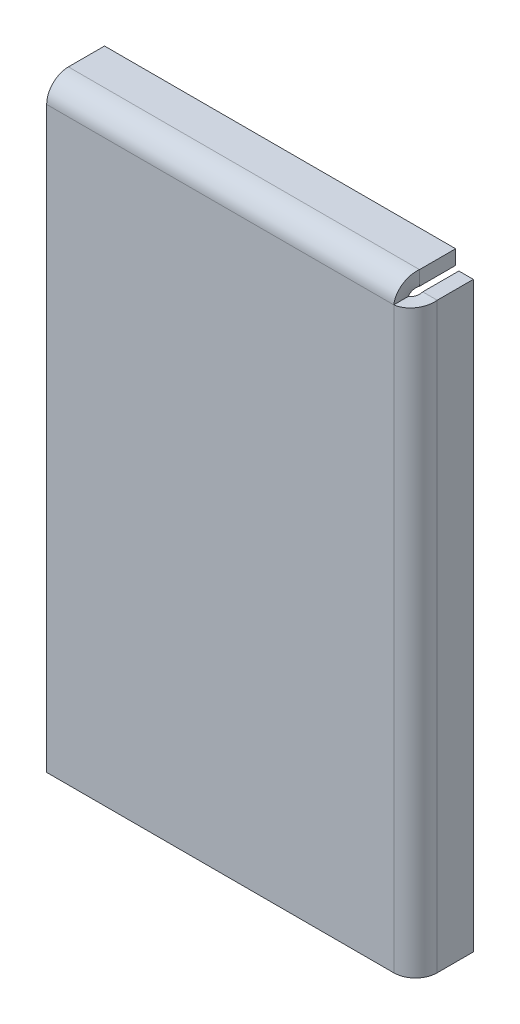
ISO-10303-21;
HEADER;
FILE_DESCRIPTION(('STEP AP214'),'2;1');
FILE_NAME('part.step','',(''),(''),'','','');
FILE_SCHEMA(('AUTOMOTIVE_DESIGN { 1 0 10303 214 1 1 1 1 }'));
ENDSEC;
DATA;
#1=APPLICATION_CONTEXT('core data for automotive mechanical design processes');
#2=APPLICATION_PROTOCOL_DEFINITION('international standard','automotive_design',2000,#1);
#3=PRODUCT_CONTEXT('',#1,'mechanical');
#4=PRODUCT('Part','Part','',(#3));
#5=PRODUCT_RELATED_PRODUCT_CATEGORY('part','',(#4));
#6=PRODUCT_DEFINITION_FORMATION('','',#4);
#7=PRODUCT_DEFINITION_CONTEXT('part definition',#1,'design');
#8=PRODUCT_DEFINITION('design','',#6,#7);
#9=PRODUCT_DEFINITION_SHAPE('','',#8);
#10=(LENGTH_UNIT() NAMED_UNIT(*) SI_UNIT(.MILLI.,.METRE.));
#11=(NAMED_UNIT(*) PLANE_ANGLE_UNIT() SI_UNIT($,.RADIAN.));
#12=(NAMED_UNIT(*) SI_UNIT($,.STERADIAN.) SOLID_ANGLE_UNIT());
#13=UNCERTAINTY_MEASURE_WITH_UNIT(LENGTH_MEASURE(1.E-05),#10,'distance_accuracy_value','');
#14=(GEOMETRIC_REPRESENTATION_CONTEXT(3) GLOBAL_UNCERTAINTY_ASSIGNED_CONTEXT((#13)) GLOBAL_UNIT_ASSIGNED_CONTEXT((#10,
#11,#12)) REPRESENTATION_CONTEXT('',''));
#15=CARTESIAN_POINT('',(0.,0.,0.));
#16=DIRECTION('',(0.,0.,1.));
#17=DIRECTION('',(1.,0.,0.));
#18=AXIS2_PLACEMENT_3D('',#15,#16,#17);
#19=CARTESIAN_POINT('',(0.,0.,-3.175));
#20=DIRECTION('',(-1.,0.,0.));
#21=DIRECTION('',(0.,-1.,0.));
#22=AXIS2_PLACEMENT_3D('',#19,#20,#21);
#23=PLANE('',#22);
#24=DIRECTION('',(0.,-1.,0.));
#25=VECTOR('',#24,1.);
#26=CARTESIAN_POINT('',(0.,0.,0.));
#27=LINE('',#26,#25);
#28=CARTESIAN_POINT('',(0.,127.,0.));
#29=VERTEX_POINT('',#28);
#30=CARTESIAN_POINT('',(0.,0.,0.));
#31=VERTEX_POINT('',#30);
#32=EDGE_CURVE('E230',#29,#31,#27,.T.);
#33=ORIENTED_EDGE('',*,*,#32,.F.);
#34=DIRECTION('',(0.,0.,1.));
#35=VECTOR('',#34,1.);
#36=CARTESIAN_POINT('',(0.,127.,-3.175));
#37=LINE('',#36,#35);
#38=CARTESIAN_POINT('',(0.,127.,-3.17499999999999));
#39=VERTEX_POINT('',#38);
#40=EDGE_CURVE('E13',#39,#29,#37,.T.);
#41=ORIENTED_EDGE('',*,*,#40,.F.);
#42=DIRECTION('',(0.,-1.,0.));
#43=VECTOR('',#42,1.);
#44=CARTESIAN_POINT('',(0.,0.,-3.175));
#45=LINE('',#44,#43);
#46=CARTESIAN_POINT('',(0.,0.,-3.175));
#47=VERTEX_POINT('',#46);
#48=EDGE_CURVE('E228',#39,#47,#45,.T.);
#49=ORIENTED_EDGE('',*,*,#48,.T.);
#50=DIRECTION('',(0.,0.,1.));
#51=VECTOR('',#50,1.);
#52=CARTESIAN_POINT('',(0.,0.,-3.175));
#53=LINE('',#52,#51);
#54=EDGE_CURVE('E81',#47,#31,#53,.T.);
#55=ORIENTED_EDGE('',*,*,#54,.T.);
#56=EDGE_LOOP('',(#33,#41,#49,#55));
#57=FACE_BOUND('',#56,.T.);
#58=ADVANCED_FACE('F78',(#57),#23,.T.);
#59=CARTESIAN_POINT('',(0.,0.,-3.175));
#60=DIRECTION('',(0.,-1.,0.));
#61=DIRECTION('',(0.,0.,-1.));
#62=AXIS2_PLACEMENT_3D('',#59,#60,#61);
#63=PLANE('',#62);
#64=DIRECTION('',(1.,0.,0.));
#65=VECTOR('',#64,1.);
#66=CARTESIAN_POINT('',(0.,0.,0.));
#67=LINE('',#66,#65);
#68=CARTESIAN_POINT('',(76.2000000000001,0.,0.));
#69=VERTEX_POINT('',#68);
#70=EDGE_CURVE('E248',#31,#69,#67,.T.);
#71=ORIENTED_EDGE('',*,*,#70,.F.);
#72=ORIENTED_EDGE('',*,*,#54,.F.);
#73=DIRECTION('',(1.,0.,0.));
#74=VECTOR('',#73,1.);
#75=CARTESIAN_POINT('',(0.,0.,-3.175));
#76=LINE('',#75,#74);
#77=CARTESIAN_POINT('',(76.2,0.,-3.17500000000002));
#78=VERTEX_POINT('',#77);
#79=EDGE_CURVE('E232',#47,#78,#76,.T.);
#80=ORIENTED_EDGE('',*,*,#79,.T.);
#81=DIRECTION('',(0.,0.,1.));
#82=VECTOR('',#81,1.);
#83=CARTESIAN_POINT('',(76.2,0.,-3.175));
#84=LINE('',#83,#82);
#85=EDGE_CURVE('E254',#78,#69,#84,.T.);
#86=ORIENTED_EDGE('',*,*,#85,.T.);
#87=EDGE_LOOP('',(#71,#72,#80,#86));
#88=FACE_BOUND('',#87,.T.);
#89=ADVANCED_FACE('F256',(#88),#63,.T.);
#90=CARTESIAN_POINT('',(0.,0.,-3.175));
#91=DIRECTION('',(0.,0.,-1.));
#92=DIRECTION('',(-1.,0.,0.));
#93=AXIS2_PLACEMENT_3D('',#90,#91,#92);
#94=PLANE('',#93);
#95=ORIENTED_EDGE('',*,*,#48,.F.);
#96=DIRECTION('',(-1.,0.,0.));
#97=VECTOR('',#96,1.);
#98=CARTESIAN_POINT('',(0.,127.,-3.175));
#99=LINE('',#98,#97);
#100=CARTESIAN_POINT('',(76.2,127.,-3.17499999999999));
#101=VERTEX_POINT('',#100);
#102=EDGE_CURVE('E214',#101,#39,#99,.T.);
#103=ORIENTED_EDGE('',*,*,#102,.F.);
#104=DIRECTION('',(0.,1.,0.));
#105=VECTOR('',#104,1.);
#106=CARTESIAN_POINT('',(76.2,0.,-3.175));
#107=LINE('',#106,#105);
#108=EDGE_CURVE('E222',#78,#101,#107,.T.);
#109=ORIENTED_EDGE('',*,*,#108,.F.);
#110=ORIENTED_EDGE('',*,*,#79,.F.);
#111=EDGE_LOOP('',(#95,#103,#109,#110));
#112=FACE_BOUND('',#111,.T.);
#113=ADVANCED_FACE('F231',(#112),#94,.T.);
#114=CARTESIAN_POINT('',(0.,0.,0.));
#115=DIRECTION('',(0.,0.,-1.));
#116=DIRECTION('',(-1.,0.,0.));
#117=AXIS2_PLACEMENT_3D('',#114,#115,#116);
#118=PLANE('',#117);
#119=ORIENTED_EDGE('',*,*,#32,.T.);
#120=ORIENTED_EDGE('',*,*,#70,.T.);
#121=DIRECTION('',(0.,1.,0.));
#122=VECTOR('',#121,1.);
#123=CARTESIAN_POINT('',(76.2,0.,0.));
#124=LINE('',#123,#122);
#125=CARTESIAN_POINT('',(76.2,127.,0.));
#126=VERTEX_POINT('',#125);
#127=EDGE_CURVE('E112',#69,#126,#124,.T.);
#128=ORIENTED_EDGE('',*,*,#127,.T.);
#129=DIRECTION('',(-1.,0.,0.));
#130=VECTOR('',#129,1.);
#131=CARTESIAN_POINT('',(0.,127.,0.));
#132=LINE('',#131,#130);
#133=EDGE_CURVE('E170',#126,#29,#132,.T.);
#134=ORIENTED_EDGE('',*,*,#133,.T.);
#135=EDGE_LOOP('',(#119,#120,#128,#134));
#136=FACE_BOUND('',#135,.T.);
#137=ADVANCED_FACE('F259',(#136),#118,.F.);
#138=CARTESIAN_POINT('',(76.1999999999999,127.,0.0317499999999844));
#139=CARTESIAN_POINT('',(76.8276774966241,127.073379161431,0.0317499999999954));
#140=CARTESIAN_POINT('',(77.4548847945894,127.146732203136,-0.0930314948829234));
#141=CARTESIAN_POINT('',(78.6144752966431,127.293464406271,-0.573349607632581));
#142=CARTESIAN_POINT('',(79.1462906122397,127.366830507839,-0.928697240832497));
#143=CARTESIAN_POINT('',(80.0338027591674,127.513562710975,-1.81620938776023));
#144=CARTESIAN_POINT('',(80.3891503923674,127.586928812542,-2.34802470335679));
#145=CARTESIAN_POINT('',(80.869468505117,127.733661015678,-3.5076152054105));
#146=CARTESIAN_POINT('',(80.99425,127.807014057382,-4.13482250337581));
#147=CARTESIAN_POINT('',(80.99425,127.880393218813,-4.76249999999998));
#148=CARTESIAN_POINT('',(76.1999999999999,127.,0.));
#149=CARTESIAN_POINT('',(76.8235206558448,127.073379148578,0.));
#150=CARTESIAN_POINT('',(77.446574299261,127.146732203136,-0.123955127367142));
#151=CARTESIAN_POINT('',(78.5984853940163,127.293464406271,-0.601092325462828));
#152=CARTESIAN_POINT('',(79.1267787538805,127.366830507839,-0.954086663078639));
#153=CARTESIAN_POINT('',(80.0084133369213,127.513562710975,-1.83572124611944));
#154=CARTESIAN_POINT('',(80.3614076745371,127.586928812542,-2.36401460598357));
#155=CARTESIAN_POINT('',(80.8385448726328,127.733661015678,-3.5159257007389));
#156=CARTESIAN_POINT('',(80.9625,127.807014070236,-4.13897934415511));
#157=CARTESIAN_POINT('',(80.9625,127.880393218813,-4.76249999999998));
#158=CARTESIAN_POINT('',(76.2,127.,-3.17500000000002));
#159=CARTESIAN_POINT('',(76.4078365779154,127.073377863208,-3.17500000000001));
#160=CARTESIAN_POINT('',(76.6155247664203,127.146732203136,-3.21631837578906));
#161=CARTESIAN_POINT('',(76.9994951313388,127.293464406271,-3.37536410848762));
#162=CARTESIAN_POINT('',(77.1755929179601,127.366830507839,-3.49302888769289));
#163=CARTESIAN_POINT('',(77.4694711123071,127.513562710975,-3.78690708203982));
#164=CARTESIAN_POINT('',(77.5871358915123,127.586928812542,-3.96300486866119));
#165=CARTESIAN_POINT('',(77.7461816242109,127.733661015678,-4.34697523357963));
#166=CARTESIAN_POINT('',(77.7875,127.807015355605,-4.55466342208453));
#167=CARTESIAN_POINT('',(77.7875,127.880393218813,-4.76249999999999));
#168=CARTESIAN_POINT('',(76.2,127.,-3.20706750000002));
#169=CARTESIAN_POINT('',(76.4036381687283,127.073377850226,-3.20706750000001));
#170=CARTESIAN_POINT('',(76.6071311661386,127.146732203136,-3.24755124459812));
#171=CARTESIAN_POINT('',(76.9833453296857,127.293464406271,-3.40338425349617));
#172=CARTESIAN_POINT('',(77.1558859410173,127.366830507839,-3.51867220416149));
#173=CARTESIAN_POINT('',(77.4438277958385,127.513562710975,-3.80661405898261));
#174=CARTESIAN_POINT('',(77.5591157465038,127.586928812542,-3.97915467031424));
#175=CARTESIAN_POINT('',(77.7149487554019,127.733661015678,-4.35536883386133));
#176=CARTESIAN_POINT('',(77.7554325,127.807015368587,-4.55886183127162));
#177=CARTESIAN_POINT('',(77.7554325,127.880393218813,-4.76249999999999));
#178=B_SPLINE_SURFACE_WITH_KNOTS('',1,3,((#138,#139,#140,#141,#142,#143,#144,#145,#146,#147),
(#148,#149,#150,#151,#152,#153,#154,#155,#156,#157),(#158,#159,#160,#161,#162,#163,#164,#165,
#166,#167),(#168,#169,#170,#171,#172,#173,#174,#175,#176,#177)),.UNSPECIFIED.,.F.,.F.,.F.,(2,1,
1,2),(4,2,2,2,4),(-0.01,0.,1.,1.0101),(0.,0.25,0.5,0.75,1.),.UNSPECIFIED.);
#179=DIRECTION('',(1.,0.,0.));
#180=VECTOR('',#179,1.);
#181=CARTESIAN_POINT('',(80.9625,127.880393218813,-4.76249999999998));
#182=LINE('',#181,#180);
#183=CARTESIAN_POINT('',(77.7875,127.880393218813,-4.76249999999999));
#184=VERTEX_POINT('',#183);
#185=CARTESIAN_POINT('',(80.9625,127.880393218813,-4.76249999999998));
#186=VERTEX_POINT('',#185);
#187=EDGE_CURVE('E136',#184,#186,#182,.T.);
#188=CARTESIAN_POINT('',(76.2,127.,-3.17500000000002));
#189=CARTESIAN_POINT('',(76.247402363432,127.016737010737,-3.17499981475755));
#190=CARTESIAN_POINT('',(76.2947822769868,127.033465079396,-3.17712453359083));
#191=CARTESIAN_POINT('',(76.3891605386355,127.066919593609,-3.18559757266885));
#192=CARTESIAN_POINT('',(76.4361589072465,127.083646039202,-3.19194566426525));
#193=CARTESIAN_POINT('',(76.575926664022,127.133793425001,-3.21725746041942));
#194=CARTESIAN_POINT('',(76.6676313331067,127.167238923494,-3.24248888627525));
#195=CARTESIAN_POINT('',(76.8450849089598,127.234132703975,-3.30887906161228));
#196=CARTESIAN_POINT('',(76.9308305381412,127.267580977521,-3.35004649569549));
#197=CARTESIAN_POINT('',(77.0936118667121,127.334470091219,-3.44698505194963));
#198=CARTESIAN_POINT('',(77.1706498450795,127.367910931019,-3.5027523402974));
#199=CARTESIAN_POINT('',(77.3135304452291,127.434780889932,-3.62708221310954));
#200=CARTESIAN_POINT('',(77.3793778688464,127.4682100079,-3.69563928288917));
#201=CARTESIAN_POINT('',(77.4978469905643,127.53507910458,-3.8434145963099));
#202=CARTESIAN_POINT('',(77.5504631890003,127.568519082042,-3.92263725224968));
#203=CARTESIAN_POINT('',(77.640769428935,127.635413567451,-4.08920529368376));
#204=CARTESIAN_POINT('',(77.678452613197,127.668868075028,-4.17655438815678));
#205=CARTESIAN_POINT('',(77.7376190345457,127.735749379145,-4.35650969066247));
#206=CARTESIAN_POINT('',(77.7591238131584,127.769176153126,-4.44910873099431));
#207=CARTESIAN_POINT('',(77.7773130996071,127.815550849876,-4.57919718644025));
#208=CARTESIAN_POINT('',(77.7811345356246,127.828531431925,-4.61578656039871));
#209=CARTESIAN_POINT('',(77.7862248825719,127.854470385735,-4.68907863702643));
#210=CARTESIAN_POINT('',(77.787498208551,127.867428756976,-4.72578103312478));
#211=CARTESIAN_POINT('',(77.7875,127.880393218813,-4.76249999999999));
#212=B_SPLINE_CURVE_WITH_KNOTS('',3,(#188,#189,#190,#191,#192,#193,#194,#195,#196,#197,#198,
#199,#200,#201,#202,#203,#204,#205,#206,#207,#208,#209,#210,#211),.UNSPECIFIED.,.F.,.F.,(4,2,2,
2,2,2,2,2,2,2,2,4),(0.,0.1507183594396,0.301428559831404,0.602339044283586,0.903413746471715,
1.2044094676375,1.50527570448953,1.80626679285071,2.10739593653535,2.4081234140516,
2.52509160845968,2.64185695878851),.UNSPECIFIED.);
#213=EDGE_CURVE('E237',#101,#184,#212,.T.);
#214=DIRECTION('',(0.,0.,1.));
#215=VECTOR('',#214,1.);
#216=CARTESIAN_POINT('',(76.2,127.,-3.175));
#217=LINE('',#216,#215);
#218=EDGE_CURVE('E87',#101,#126,#217,.T.);
#219=CARTESIAN_POINT('',(76.1999999999999,127.,0.));
#220=CARTESIAN_POINT('',(76.3351217373917,127.015902452668,1.49130135511463E-05));
#221=CARTESIAN_POINT('',(76.4702413553164,127.031804653429,-0.00574988729570535));
#222=CARTESIAN_POINT('',(76.7394971488482,127.063607609756,-0.0287312355015262));
#223=CARTESIAN_POINT('',(76.8736333708521,127.079508365356,-0.0459472395661578));
#224=CARTESIAN_POINT('',(77.1398527086578,127.111296644366,-0.0917055490820597));
#225=CARTESIAN_POINT('',(77.2719373389093,127.127184168457,-0.120239042567627));
#226=CARTESIAN_POINT('',(77.53320373712,127.158960443307,-0.188421043753178));
#227=CARTESIAN_POINT('',(77.6623855459769,127.174849194044,-0.228069394750131));
#228=CARTESIAN_POINT('',(77.916729620662,127.206603567169,-0.318130474196733));
#229=CARTESIAN_POINT('',(78.0418974464399,127.222469189667,-0.368527501335669));
#230=CARTESIAN_POINT('',(78.2875526929391,127.254206617939,-0.47977689466703));
#231=CARTESIAN_POINT('',(78.4080383760234,127.270078423842,-0.540633097882401));
#232=CARTESIAN_POINT('',(78.6433474070995,127.301811832784,-0.67231328692068));
#233=CARTESIAN_POINT('',(78.7581738111848,127.317673436661,-0.743131811507612));
#234=CARTESIAN_POINT('',(78.9814461663099,127.349402355197,-0.8942777136956));
#235=CARTESIAN_POINT('',(79.0898898860102,127.365269669925,-0.974608387460757));
#236=CARTESIAN_POINT('',(79.2995516663174,127.397002672854,-1.14416349750693));
#237=CARTESIAN_POINT('',(79.4007710956283,127.41286836079,-1.23338624139178));
#238=CARTESIAN_POINT('',(79.5952776857689,127.444599400131,-1.4200953330034));
#239=CARTESIAN_POINT('',(79.6885648458592,127.460464751535,-1.51758168150049));
#240=CARTESIAN_POINT('',(79.8665697071934,127.492201528687,-1.72015543784046));
#241=CARTESIAN_POINT('',(79.9512840131085,127.508072954362,-1.8252458292679));
#242=CARTESIAN_POINT('',(80.1114624248026,127.539808967282,-2.04219798184568));
#243=CARTESIAN_POINT('',(80.1869297323854,127.555673554988,-2.15405737904998));
#244=CARTESIAN_POINT('',(80.3281453507705,127.587413105389,-2.38384111802048));
#245=CARTESIAN_POINT('',(80.393887990194,127.603288068758,-2.50176894525578));
#246=CARTESIAN_POINT('',(80.5151055010885,127.635032578791,-2.74273403138111));
#247=CARTESIAN_POINT('',(80.5705841068999,127.65090212532,-2.8657694119746));
#248=CARTESIAN_POINT('',(80.6708848992769,127.682636059502,-3.11606098760628));
#249=CARTESIAN_POINT('',(80.7157108764114,127.698500446979,-3.24331566285286));
#250=CARTESIAN_POINT('',(80.7943998898735,127.730222763945,-3.50112561233577));
#251=CARTESIAN_POINT('',(80.8282658217052,127.746080694031,-3.63168000498657));
#252=CARTESIAN_POINT('',(80.8917440289277,127.781695032184,-3.92758289656774));
#253=CARTESIAN_POINT('',(80.9182691884881,127.801452432098,-4.09360236702804));
#254=CARTESIAN_POINT('',(80.9536537049578,127.840938184339,-4.42725548909671));
#255=CARTESIAN_POINT('',(80.9625399688205,127.860666534965,-4.59488628956768));
#256=CARTESIAN_POINT('',(80.9625,127.880393218813,-4.76249999999998));
#257=B_SPLINE_CURVE_WITH_KNOTS('',3,(#219,#220,#221,#222,#223,#224,#225,#226,#227,#228,#229,
#230,#231,#232,#233,#234,#235,#236,#237,#238,#239,#240,#241,#242,#243,#244,#245,#246,#247,#248,
#249,#250,#251,#252,#253,#254,#255,#256),.UNSPECIFIED.,.F.,.F.,(4,2,2,2,2,2,2,2,2,2,2,2,2,2,2,2,
2,2,4),(0.,0.408037813372089,0.816056249903534,1.22375761888679,1.63145324017354,
2.03855734295494,2.44581111480624,2.85284249831813,3.26001534199348,3.66711083736656,
4.07420637068784,4.4814625106892,4.8885772360041,5.29592846037993,5.70313118635492,
6.1101887980107,6.51713878228911,7.02402879516921,7.53014498525619),.UNSPECIFIED.);
#258=EDGE_CURVE('E249',#126,#186,#257,.T.);
#259=ORIENTED_EDGE('',*,*,#187,.F.);
#260=ORIENTED_EDGE('',*,*,#213,.F.);
#261=ORIENTED_EDGE('',*,*,#218,.T.);
#262=ORIENTED_EDGE('',*,*,#258,.T.);
#263=EDGE_LOOP('',(#259,#260,#261,#262));
#264=FACE_BOUND('',#263,.T.);
#265=ADVANCED_FACE('F261',(#264),#178,.F.);
#266=CARTESIAN_POINT('',(76.2,0.,-4.76249999999999));
#267=DIRECTION('',(0.,1.,0.));
#268=DIRECTION('',(0.,0.,1.));
#269=AXIS2_PLACEMENT_3D('',#266,#267,#268);
#270=PLANE('',#269);
#271=CARTESIAN_POINT('',(76.2,0.,-4.76249999999999));
#272=DIRECTION('',(0.,-1.,0.));
#273=DIRECTION('',(0.,0.,-1.));
#274=AXIS2_PLACEMENT_3D('',#271,#272,#273);
#275=CIRCLE('',#274,1.58749999999998);
#276=CARTESIAN_POINT('',(77.7875,0.,-4.76249999999999));
#277=VERTEX_POINT('',#276);
#278=EDGE_CURVE('E532',#277,#78,#275,.T.);
#279=ORIENTED_EDGE('',*,*,#278,.F.);
#280=DIRECTION('',(1.,0.,0.));
#281=VECTOR('',#280,1.);
#282=CARTESIAN_POINT('',(77.7875,0.,-4.76249999999999));
#283=LINE('',#282,#281);
#284=CARTESIAN_POINT('',(80.9625,0.,-4.76249999999998));
#285=VERTEX_POINT('',#284);
#286=EDGE_CURVE('E554',#277,#285,#283,.T.);
#287=ORIENTED_EDGE('',*,*,#286,.T.);
#288=CARTESIAN_POINT('',(76.2,0.,-4.76249999999999));
#289=DIRECTION('',(0.,-1.,0.));
#290=DIRECTION('',(0.,0.,-1.));
#291=AXIS2_PLACEMENT_3D('',#288,#289,#290);
#292=CIRCLE('',#291,4.76249999999998);
#293=EDGE_CURVE('E139',#285,#69,#292,.T.);
#294=ORIENTED_EDGE('',*,*,#293,.T.);
#295=ORIENTED_EDGE('',*,*,#85,.F.);
#296=EDGE_LOOP('',(#279,#287,#294,#295));
#297=FACE_BOUND('',#296,.T.);
#298=ADVANCED_FACE('F267',(#297),#270,.F.);
#299=CARTESIAN_POINT('',(76.2,0.,-4.76249999999999));
#300=DIRECTION('',(0.,-1.,0.));
#301=DIRECTION('',(1.,0.,0.));
#302=AXIS2_PLACEMENT_3D('',#299,#300,#301);
#303=CYLINDRICAL_SURFACE('',#302,4.76249999999998);
#304=ORIENTED_EDGE('',*,*,#127,.F.);
#305=ORIENTED_EDGE('',*,*,#293,.F.);
#306=DIRECTION('',(0.,-1.,0.));
#307=VECTOR('',#306,1.);
#308=CARTESIAN_POINT('',(80.9625,0.,-4.76249999999998));
#309=LINE('',#308,#307);
#310=EDGE_CURVE('E556',#186,#285,#309,.T.);
#311=ORIENTED_EDGE('',*,*,#310,.F.);
#312=ORIENTED_EDGE('',*,*,#258,.F.);
#313=EDGE_LOOP('',(#304,#305,#311,#312));
#314=FACE_BOUND('',#313,.T.);
#315=ADVANCED_FACE('F301',(#314),#303,.T.);
#316=CARTESIAN_POINT('',(76.2,0.,-4.76249999999999));
#317=DIRECTION('',(0.,-1.,0.));
#318=DIRECTION('',(1.,0.,0.));
#319=AXIS2_PLACEMENT_3D('',#316,#317,#318);
#320=CYLINDRICAL_SURFACE('',#319,1.58749999999998);
#321=ORIENTED_EDGE('',*,*,#108,.T.);
#322=ORIENTED_EDGE('',*,*,#213,.T.);
#323=DIRECTION('',(0.,1.,0.));
#324=VECTOR('',#323,1.);
#325=CARTESIAN_POINT('',(77.7875,127.,-4.76249999999999));
#326=LINE('',#325,#324);
#327=EDGE_CURVE('E128',#184,#277,#326,.F.);
#328=ORIENTED_EDGE('',*,*,#327,.T.);
#329=ORIENTED_EDGE('',*,*,#278,.T.);
#330=EDGE_LOOP('',(#321,#322,#328,#329));
#331=FACE_BOUND('',#330,.T.);
#332=ADVANCED_FACE('F311',(#331),#320,.F.);
#333=CARTESIAN_POINT('',(80.9625,0.,-3.17499999999999));
#334=DIRECTION('',(0.,-1.,0.));
#335=DIRECTION('',(0.,0.,-1.));
#336=AXIS2_PLACEMENT_3D('',#333,#334,#335);
#337=PLANE('',#336);
#338=DIRECTION('',(0.,0.,1.));
#339=VECTOR('',#338,1.);
#340=CARTESIAN_POINT('',(80.9625,0.,-3.17499999999999));
#341=LINE('',#340,#339);
#342=CARTESIAN_POINT('',(80.9625,0.,-12.7));
#343=VERTEX_POINT('',#342);
#344=EDGE_CURVE('E564',#343,#285,#341,.T.);
#345=ORIENTED_EDGE('',*,*,#344,.T.);
#346=ORIENTED_EDGE('',*,*,#286,.F.);
#347=DIRECTION('',(0.,0.,-1.));
#348=VECTOR('',#347,1.);
#349=CARTESIAN_POINT('',(77.7875,0.,2.22044604925031E-13));
#350=LINE('',#349,#348);
#351=CARTESIAN_POINT('',(77.7875,0.,-12.7));
#352=VERTEX_POINT('',#351);
#353=EDGE_CURVE('E560',#352,#277,#350,.F.);
#354=ORIENTED_EDGE('',*,*,#353,.F.);
#355=DIRECTION('',(-1.,0.,0.));
#356=VECTOR('',#355,1.);
#357=CARTESIAN_POINT('',(80.9625,0.,-12.7));
#358=LINE('',#357,#356);
#359=EDGE_CURVE('E543',#343,#352,#358,.T.);
#360=ORIENTED_EDGE('',*,*,#359,.F.);
#361=EDGE_LOOP('',(#345,#346,#354,#360));
#362=FACE_BOUND('',#361,.T.);
#363=ADVANCED_FACE('F321',(#362),#337,.T.);
#364=CARTESIAN_POINT('',(80.9625,0.,2.33130058175858E-13));
#365=DIRECTION('',(1.,0.,0.));
#366=DIRECTION('',(0.,0.,-1.));
#367=AXIS2_PLACEMENT_3D('',#364,#365,#366);
#368=PLANE('',#367);
#369=DIRECTION('',(0.,-1.,0.));
#370=VECTOR('',#369,1.);
#371=CARTESIAN_POINT('',(80.9625,0.,-12.7));
#372=LINE('',#371,#370);
#373=CARTESIAN_POINT('',(80.9625,127.880393218813,-12.7));
#374=VERTEX_POINT('',#373);
#375=EDGE_CURVE('E162',#374,#343,#372,.T.);
#376=ORIENTED_EDGE('',*,*,#375,.F.);
#377=DIRECTION('',(0.,0.,-1.));
#378=VECTOR('',#377,1.);
#379=CARTESIAN_POINT('',(80.9625,127.880393218813,-12.7));
#380=LINE('',#379,#378);
#381=EDGE_CURVE('E548',#186,#374,#380,.T.);
#382=ORIENTED_EDGE('',*,*,#381,.F.);
#383=ORIENTED_EDGE('',*,*,#310,.T.);
#384=ORIENTED_EDGE('',*,*,#344,.F.);
#385=EDGE_LOOP('',(#376,#382,#383,#384));
#386=FACE_BOUND('',#385,.T.);
#387=ADVANCED_FACE('F330',(#386),#368,.T.);
#388=CARTESIAN_POINT('',(77.7875,0.,2.22044604925031E-13));
#389=DIRECTION('',(1.,0.,0.));
#390=DIRECTION('',(0.,0.,-1.));
#391=AXIS2_PLACEMENT_3D('',#388,#389,#390);
#392=PLANE('',#391);
#393=ORIENTED_EDGE('',*,*,#327,.F.);
#394=DIRECTION('',(0.,0.,1.));
#395=VECTOR('',#394,1.);
#396=CARTESIAN_POINT('',(77.7875,127.880393218813,2.22044604925031E-13));
#397=LINE('',#396,#395);
#398=CARTESIAN_POINT('',(77.7875,127.880393218813,-12.7));
#399=VERTEX_POINT('',#398);
#400=EDGE_CURVE('E545',#184,#399,#397,.F.);
#401=ORIENTED_EDGE('',*,*,#400,.T.);
#402=DIRECTION('',(0.,1.,0.));
#403=VECTOR('',#402,1.);
#404=CARTESIAN_POINT('',(77.7875,0.,-12.7));
#405=LINE('',#404,#403);
#406=EDGE_CURVE('E154',#399,#352,#405,.F.);
#407=ORIENTED_EDGE('',*,*,#406,.T.);
#408=ORIENTED_EDGE('',*,*,#353,.T.);
#409=EDGE_LOOP('',(#393,#401,#407,#408));
#410=FACE_BOUND('',#409,.T.);
#411=ADVANCED_FACE('F341',(#410),#392,.F.);
#412=CARTESIAN_POINT('',(80.9625,0.,-12.7));
#413=DIRECTION('',(0.,0.,-1.));
#414=DIRECTION('',(-1.,0.,0.));
#415=AXIS2_PLACEMENT_3D('',#412,#413,#414);
#416=PLANE('',#415);
#417=ORIENTED_EDGE('',*,*,#406,.F.);
#418=DIRECTION('',(-1.,0.,0.));
#419=VECTOR('',#418,1.);
#420=CARTESIAN_POINT('',(80.9625,127.880393218813,-12.7));
#421=LINE('',#420,#419);
#422=EDGE_CURVE('E550',#374,#399,#421,.T.);
#423=ORIENTED_EDGE('',*,*,#422,.F.);
#424=ORIENTED_EDGE('',*,*,#375,.T.);
#425=ORIENTED_EDGE('',*,*,#359,.T.);
#426=EDGE_LOOP('',(#417,#423,#424,#425));
#427=FACE_BOUND('',#426,.T.);
#428=ADVANCED_FACE('F351',(#427),#416,.T.);
#429=CARTESIAN_POINT('',(80.9625,127.880393218813,-12.7));
#430=DIRECTION('',(0.,1.,0.));
#431=DIRECTION('',(-1.,0.,0.));
#432=AXIS2_PLACEMENT_3D('',#429,#430,#431);
#433=PLANE('',#432);
#434=ORIENTED_EDGE('',*,*,#400,.F.);
#435=ORIENTED_EDGE('',*,*,#187,.T.);
#436=ORIENTED_EDGE('',*,*,#381,.T.);
#437=ORIENTED_EDGE('',*,*,#422,.T.);
#438=EDGE_LOOP('',(#434,#435,#436,#437));
#439=FACE_BOUND('',#438,.T.);
#440=ADVANCED_FACE('F362',(#439),#433,.T.);
#441=CARTESIAN_POINT('',(0.,127.,-4.76250000000001));
#442=DIRECTION('',(-1.,0.,0.));
#443=DIRECTION('',(0.,0.,1.));
#444=AXIS2_PLACEMENT_3D('',#441,#442,#443);
#445=PLANE('',#444);
#446=DIRECTION('',(0.,1.,0.));
#447=VECTOR('',#446,1.);
#448=CARTESIAN_POINT('',(0.,131.7625,-4.76249999999999));
#449=LINE('',#448,#447);
#450=CARTESIAN_POINT('',(0.,128.5875,-4.7625));
#451=VERTEX_POINT('',#450);
#452=CARTESIAN_POINT('',(0.,131.7625,-4.76249999999999));
#453=VERTEX_POINT('',#452);
#454=EDGE_CURVE('E193',#451,#453,#449,.T.);
#455=ORIENTED_EDGE('',*,*,#454,.F.);
#456=CARTESIAN_POINT('',(0.,127.,-4.76250000000001));
#457=DIRECTION('',(1.,0.,0.));
#458=DIRECTION('',(0.,0.,-1.));
#459=AXIS2_PLACEMENT_3D('',#456,#457,#458);
#460=CIRCLE('',#459,1.58750000000002);
#461=EDGE_CURVE('E216',#39,#451,#460,.F.);
#462=ORIENTED_EDGE('',*,*,#461,.F.);
#463=ORIENTED_EDGE('',*,*,#40,.T.);
#464=CARTESIAN_POINT('',(0.,127.,-4.76250000000001));
#465=DIRECTION('',(1.,0.,0.));
#466=DIRECTION('',(0.,0.,-1.));
#467=AXIS2_PLACEMENT_3D('',#464,#465,#466);
#468=CIRCLE('',#467,4.76250000000002);
#469=EDGE_CURVE('E509',#29,#453,#468,.F.);
#470=ORIENTED_EDGE('',*,*,#469,.T.);
#471=EDGE_LOOP('',(#455,#462,#463,#470));
#472=FACE_BOUND('',#471,.T.);
#473=ADVANCED_FACE('F225',(#472),#445,.T.);
#474=CARTESIAN_POINT('',(77.0803932188134,131.79425,-4.76249999999999));
#475=CARTESIAN_POINT('',(77.0070140573822,131.79425,-4.13482250337584));
#476=CARTESIAN_POINT('',(76.9336610156779,131.669468505117,-3.50761520541051));
#477=CARTESIAN_POINT('',(76.7869288125423,131.189150392367,-2.34802470335679));
#478=CARTESIAN_POINT('',(76.7135627109745,130.833802759167,-1.81620938776025));
#479=CARTESIAN_POINT('',(76.5668305078389,129.94629061224,-0.92869724083251));
#480=CARTESIAN_POINT('',(76.4934644062711,129.414475296643,-0.573349607632593));
#481=CARTESIAN_POINT('',(76.3467322031356,128.254884794589,-0.0930314948829196));
#482=CARTESIAN_POINT('',(76.2733791614313,127.627677496624,0.0317500000000121));
#483=CARTESIAN_POINT('',(76.2,127.,0.0317500000000121));
#484=CARTESIAN_POINT('',(77.0803932188134,131.7625,-4.76249999999999));
#485=CARTESIAN_POINT('',(77.0070140702358,131.7625,-4.13897934415513));
#486=CARTESIAN_POINT('',(76.9336610156779,131.638544872633,-3.51592570073891));
#487=CARTESIAN_POINT('',(76.7869288125423,131.161407674537,-2.36401460598357));
#488=CARTESIAN_POINT('',(76.7135627109745,130.808413336921,-1.83572124611945));
#489=CARTESIAN_POINT('',(76.5668305078389,129.926778753881,-0.954086663078652));
#490=CARTESIAN_POINT('',(76.4934644062711,129.398485394016,-0.601092325462841));
#491=CARTESIAN_POINT('',(76.3467322031356,128.246574299261,-0.123955127367139));
#492=CARTESIAN_POINT('',(76.2733791485776,127.623520655845,0.));
#493=CARTESIAN_POINT('',(76.2,127.,0.));
#494=CARTESIAN_POINT('',(77.0803932188134,128.5875,-4.7625));
#495=CARTESIAN_POINT('',(77.0070153556051,128.5875,-4.55466342208456));
#496=CARTESIAN_POINT('',(76.9336610156779,128.546181624211,-4.34697523357964));
#497=CARTESIAN_POINT('',(76.7869288125423,128.387135891512,-3.96300486866119));
#498=CARTESIAN_POINT('',(76.7135627109745,128.269471112307,-3.78690708203982));
#499=CARTESIAN_POINT('',(76.5668305078389,127.97559291796,-3.49302888769288));
#500=CARTESIAN_POINT('',(76.4934644062711,127.799495131339,-3.37536410848761));
#501=CARTESIAN_POINT('',(76.3467322031356,127.41552476642,-3.21631837578904));
#502=CARTESIAN_POINT('',(76.2733778632083,127.207836577915,-3.17499999999999));
#503=CARTESIAN_POINT('',(76.2,127.,-3.17499999999999));
#504=CARTESIAN_POINT('',(77.0803932188134,128.5554325,-4.7625));
#505=CARTESIAN_POINT('',(77.0070153685873,128.5554325,-4.55886183127165));
#506=CARTESIAN_POINT('',(76.9336610156779,128.514948755402,-4.35536883386133));
#507=CARTESIAN_POINT('',(76.7869288125423,128.359115746504,-3.97915467031424));
#508=CARTESIAN_POINT('',(76.7135627109745,128.243827795839,-3.80661405898261));
#509=CARTESIAN_POINT('',(76.5668305078389,127.955885941017,-3.51867220416148));
#510=CARTESIAN_POINT('',(76.4934644062711,127.783345329686,-3.40338425349616));
#511=CARTESIAN_POINT('',(76.3467322031356,127.407131166139,-3.2475512445981));
#512=CARTESIAN_POINT('',(76.2733778502261,127.203638168728,-3.20706749999999));
#513=CARTESIAN_POINT('',(76.2,127.,-3.20706749999999));
#514=B_SPLINE_SURFACE_WITH_KNOTS('',1,3,((#474,#475,#476,#477,#478,#479,#480,#481,#482,#483),
(#484,#485,#486,#487,#488,#489,#490,#491,#492,#493),(#494,#495,#496,#497,#498,#499,#500,#501,
#502,#503),(#504,#505,#506,#507,#508,#509,#510,#511,#512,#513)),.UNSPECIFIED.,.F.,.F.,.F.,(2,1,
1,2),(4,2,2,2,4),(-0.01,0.,1.,1.0101),(0.,0.25,0.5,0.75,1.),.UNSPECIFIED.);
#515=CARTESIAN_POINT('',(77.0803932188134,128.5875,-4.7625));
#516=CARTESIAN_POINT('',(77.0636562080769,128.587500185242,-4.71509763656799));
#517=CARTESIAN_POINT('',(77.0469281394173,128.585375466409,-4.66771772301322));
#518=CARTESIAN_POINT('',(77.0134736252042,128.576902427331,-4.57333946136443));
#519=CARTESIAN_POINT('',(76.9967471796116,128.570554335735,-4.52634109275344));
#520=CARTESIAN_POINT('',(76.9465997938125,128.545242539581,-4.38657333597791));
#521=CARTESIAN_POINT('',(76.9131542953196,128.520011113725,-4.29486866689328));
#522=CARTESIAN_POINT('',(76.8462605148384,128.453620938388,-4.11741509104012));
#523=CARTESIAN_POINT('',(76.812812241292,128.412453504305,-4.03166946185875));
#524=CARTESIAN_POINT('',(76.7459231275942,128.31551494805,-3.86888813328783));
#525=CARTESIAN_POINT('',(76.7124822877945,128.259747659703,-3.7918501549204));
#526=CARTESIAN_POINT('',(76.645612328881,128.13541778689,-3.64896955477087));
#527=CARTESIAN_POINT('',(76.6121832109135,128.066860717111,-3.58312213115351));
#528=CARTESIAN_POINT('',(76.5453141142339,127.91908540369,-3.46465300943567));
#529=CARTESIAN_POINT('',(76.5118741367715,127.83986274775,-3.41203681099964));
#530=CARTESIAN_POINT('',(76.4449796513622,127.673294706316,-3.3217305710649));
#531=CARTESIAN_POINT('',(76.4115251437858,127.585945611843,-3.28404738680299));
#532=CARTESIAN_POINT('',(76.3446438396686,127.405990309337,-3.22488096545422));
#533=CARTESIAN_POINT('',(76.3112170656872,127.313391269006,-3.20337618684156));
#534=CARTESIAN_POINT('',(76.2648423689373,127.18330281356,-3.18518690039283));
#535=CARTESIAN_POINT('',(76.2518617868886,127.146713439601,-3.18136546437533));
#536=CARTESIAN_POINT('',(76.2259228330782,127.073421362974,-3.17627511742802));
#537=CARTESIAN_POINT('',(76.2129644618374,127.036718966875,-3.17500179144894));
#538=CARTESIAN_POINT('',(76.2,127.,-3.17499999999999));
#539=B_SPLINE_CURVE_WITH_KNOTS('',3,(#515,#516,#517,#518,#519,#520,#521,#522,#523,#524,#525,
#526,#527,#528,#529,#530,#531,#532,#533,#534,#535,#536,#537,#538),.UNSPECIFIED.,.F.,.F.,(4,2,2,
2,2,2,2,2,2,2,2,4),(0.,0.150718359439601,0.301428559831401,0.60233904428361,0.903413746471755,
1.20440946763755,1.50527570448958,1.80626679285077,2.1073959365354,2.40812341405167,
2.52509160845974,2.64185695878854),.UNSPECIFIED.);
#540=CARTESIAN_POINT('',(77.0803932188134,128.5875,-4.7625));
#541=VERTEX_POINT('',#540);
#542=EDGE_CURVE('E217',#541,#101,#539,.T.);
#543=DIRECTION('',(0.,1.,0.));
#544=VECTOR('',#543,1.);
#545=CARTESIAN_POINT('',(77.0803932188134,128.5875,-4.7625));
#546=LINE('',#545,#544);
#547=CARTESIAN_POINT('',(77.0803932188134,131.7625,-4.76249999999999));
#548=VERTEX_POINT('',#547);
#549=EDGE_CURVE('E571',#541,#548,#546,.T.);
#550=CARTESIAN_POINT('',(77.0803932188134,131.7625,-4.76249999999999));
#551=CARTESIAN_POINT('',(77.0644907661455,131.762514913014,-4.62737826260815));
#552=CARTESIAN_POINT('',(77.0485885653848,131.756750112704,-4.49225864468347));
#553=CARTESIAN_POINT('',(77.0167856090574,131.733768764499,-4.2230028511517));
#554=CARTESIAN_POINT('',(77.0008848534579,131.716552760434,-4.08886662914775));
#555=CARTESIAN_POINT('',(76.9690965744476,131.670794450918,-3.82264729134213));
#556=CARTESIAN_POINT('',(76.9532090503562,131.642260957432,-3.69056266109058));
#557=CARTESIAN_POINT('',(76.9214327755069,131.574078956247,-3.42929626287988));
#558=CARTESIAN_POINT('',(76.9055440247696,131.53443060525,-3.30011445402297));
#559=CARTESIAN_POINT('',(76.8737896516442,131.444369525803,-3.0457703793379));
#560=CARTESIAN_POINT('',(76.8579240291464,131.393972498664,-2.92060255356));
#561=CARTESIAN_POINT('',(76.8261866008745,131.282723105333,-2.67494730706073));
#562=CARTESIAN_POINT('',(76.8103147949715,131.221866902118,-2.55446162397651));
#563=CARTESIAN_POINT('',(76.7785813860299,131.090186713079,-2.31915259290045));
#564=CARTESIAN_POINT('',(76.7627197821526,131.019368188492,-2.20432618881509));
#565=CARTESIAN_POINT('',(76.7309908636162,130.868222286304,-1.98105383369003));
#566=CARTESIAN_POINT('',(76.7151235488882,130.787891612539,-1.87261011398974));
#567=CARTESIAN_POINT('',(76.6833905459598,130.618336502493,-1.66294833368245));
#568=CARTESIAN_POINT('',(76.667524858023,130.529113758608,-1.56172890437157));
#569=CARTESIAN_POINT('',(76.6357938186823,130.342404666997,-1.36722231423098));
#570=CARTESIAN_POINT('',(76.6199284672784,130.244918318499,-1.27393515414069));
#571=CARTESIAN_POINT('',(76.5881916901266,130.042344562159,-1.09593029280645));
#572=CARTESIAN_POINT('',(76.5723202644515,129.937254170732,-1.01121598689138));
#573=CARTESIAN_POINT('',(76.5405842515315,129.720302018154,-0.85103757519734));
#574=CARTESIAN_POINT('',(76.5247196638258,129.60844262095,-0.775570267614469));
#575=CARTESIAN_POINT('',(76.4929801134242,129.378658881979,-0.634354649229413));
#576=CARTESIAN_POINT('',(76.477105150055,129.260731054744,-0.568612009805857));
#577=CARTESIAN_POINT('',(76.4453606400223,129.019765968619,-0.447394498911414));
#578=CARTESIAN_POINT('',(76.4294910934937,128.896730588025,-0.391915893100033));
#579=CARTESIAN_POINT('',(76.3977571593111,128.646439012394,-0.291615100723058));
#580=CARTESIAN_POINT('',(76.3818927718339,128.519184337147,-0.246789123588559));
#581=CARTESIAN_POINT('',(76.3501704548689,128.261374387664,-0.168100110126412));
#582=CARTESIAN_POINT('',(76.3343125247825,128.130819995013,-0.13423417829474));
#583=CARTESIAN_POINT('',(76.2986981866295,127.834917103432,-0.0707559710722042));
#584=CARTESIAN_POINT('',(76.2789407867158,127.668897632972,-0.0442308115118906));
#585=CARTESIAN_POINT('',(76.2394550344747,127.335244510903,-0.0088462950421953));
#586=CARTESIAN_POINT('',(76.2197266838483,127.167613710432,3.99688205219541E-05));
#587=CARTESIAN_POINT('',(76.2,127.,0.));
#588=B_SPLINE_CURVE_WITH_KNOTS('',3,(#550,#551,#552,#553,#554,#555,#556,#557,#558,#559,#560,
#561,#562,#563,#564,#565,#566,#567,#568,#569,#570,#571,#572,#573,#574,#575,#576,#577,#578,#579,
#580,#581,#582,#583,#584,#585,#586,#587),.UNSPECIFIED.,.F.,.F.,(4,2,2,2,2,2,2,2,2,2,2,2,2,2,2,2,
2,2,4),(0.,0.408037813372103,0.81605624990355,1.2237576188868,1.63145324017356,2.03855734295495,
2.44581111480626,2.85284249831814,3.2600153419935,3.66711083736658,4.07420637068786,
4.48146251068924,4.88857723600415,5.29592846037999,5.70313118635498,6.11018879801079,
6.51713878228921,7.02402879516926,7.53014498525618),.UNSPECIFIED.);
#589=EDGE_CURVE('E226',#548,#126,#588,.T.);
#590=ORIENTED_EDGE('',*,*,#542,.F.);
#591=ORIENTED_EDGE('',*,*,#549,.T.);
#592=ORIENTED_EDGE('',*,*,#589,.T.);
#593=ORIENTED_EDGE('',*,*,#218,.F.);
#594=EDGE_LOOP('',(#590,#591,#592,#593));
#595=FACE_BOUND('',#594,.T.);
#596=ADVANCED_FACE('F382',(#595),#514,.F.);
#597=CARTESIAN_POINT('',(77.0803932188134,127.,-4.76250000000001));
#598=DIRECTION('',(1.,0.,0.));
#599=DIRECTION('',(0.,1.,0.));
#600=AXIS2_PLACEMENT_3D('',#597,#598,#599);
#601=CYLINDRICAL_SURFACE('',#600,4.76250000000002);
#602=ORIENTED_EDGE('',*,*,#133,.F.);
#603=ORIENTED_EDGE('',*,*,#589,.F.);
#604=DIRECTION('',(1.,0.,0.));
#605=VECTOR('',#604,1.);
#606=CARTESIAN_POINT('',(0.,131.7625,-4.76249999999999));
#607=LINE('',#606,#605);
#608=EDGE_CURVE('E573',#548,#453,#607,.F.);
#609=ORIENTED_EDGE('',*,*,#608,.T.);
#610=ORIENTED_EDGE('',*,*,#469,.F.);
#611=EDGE_LOOP('',(#602,#603,#609,#610));
#612=FACE_BOUND('',#611,.T.);
#613=ADVANCED_FACE('F392',(#612),#601,.T.);
#614=CARTESIAN_POINT('',(77.0803932188134,127.,-4.76250000000001));
#615=DIRECTION('',(1.,0.,0.));
#616=DIRECTION('',(0.,1.,0.));
#617=AXIS2_PLACEMENT_3D('',#614,#615,#616);
#618=CYLINDRICAL_SURFACE('',#617,1.58750000000002);
#619=ORIENTED_EDGE('',*,*,#102,.T.);
#620=ORIENTED_EDGE('',*,*,#461,.T.);
#621=DIRECTION('',(1.,0.,0.));
#622=VECTOR('',#621,1.);
#623=CARTESIAN_POINT('',(0.,128.5875,-4.7625));
#624=LINE('',#623,#622);
#625=EDGE_CURVE('E184',#451,#541,#624,.T.);
#626=ORIENTED_EDGE('',*,*,#625,.T.);
#627=ORIENTED_EDGE('',*,*,#542,.T.);
#628=EDGE_LOOP('',(#619,#620,#626,#627));
#629=FACE_BOUND('',#628,.T.);
#630=ADVANCED_FACE('F215',(#629),#618,.F.);
#631=CARTESIAN_POINT('',(0.,131.7625,-3.17499999999999));
#632=DIRECTION('',(-1.,0.,0.));
#633=DIRECTION('',(0.,0.,1.));
#634=AXIS2_PLACEMENT_3D('',#631,#632,#633);
#635=PLANE('',#634);
#636=DIRECTION('',(0.,0.,-1.));
#637=VECTOR('',#636,1.);
#638=CARTESIAN_POINT('',(0.,128.5875,3.70074341541719E-13));
#639=LINE('',#638,#637);
#640=CARTESIAN_POINT('',(0.,128.5875,-12.7));
#641=VERTEX_POINT('',#640);
#642=EDGE_CURVE('E575',#451,#641,#639,.T.);
#643=ORIENTED_EDGE('',*,*,#642,.F.);
#644=ORIENTED_EDGE('',*,*,#454,.T.);
#645=DIRECTION('',(0.,0.,1.));
#646=VECTOR('',#645,1.);
#647=CARTESIAN_POINT('',(0.,131.7625,-3.17499999999999));
#648=LINE('',#647,#646);
#649=CARTESIAN_POINT('',(0.,131.7625,-12.7));
#650=VERTEX_POINT('',#649);
#651=EDGE_CURVE('E200',#453,#650,#648,.F.);
#652=ORIENTED_EDGE('',*,*,#651,.T.);
#653=DIRECTION('',(0.,-1.,0.));
#654=VECTOR('',#653,1.);
#655=CARTESIAN_POINT('',(0.,131.7625,-12.7));
#656=LINE('',#655,#654);
#657=EDGE_CURVE('E584',#650,#641,#656,.T.);
#658=ORIENTED_EDGE('',*,*,#657,.T.);
#659=EDGE_LOOP('',(#643,#644,#652,#658));
#660=FACE_BOUND('',#659,.T.);
#661=ADVANCED_FACE('F412',(#660),#635,.T.);
#662=CARTESIAN_POINT('',(0.,131.7625,3.81159794792545E-13));
#663=DIRECTION('',(0.,-1.,0.));
#664=DIRECTION('',(0.,0.,-1.));
#665=AXIS2_PLACEMENT_3D('',#662,#663,#664);
#666=PLANE('',#665);
#667=ORIENTED_EDGE('',*,*,#608,.F.);
#668=DIRECTION('',(0.,0.,-1.));
#669=VECTOR('',#668,1.);
#670=CARTESIAN_POINT('',(77.0803932188134,131.7625,-12.7));
#671=LINE('',#670,#669);
#672=CARTESIAN_POINT('',(77.0803932188134,131.7625,-12.7));
#673=VERTEX_POINT('',#672);
#674=EDGE_CURVE('E597',#673,#548,#671,.F.);
#675=ORIENTED_EDGE('',*,*,#674,.F.);
#676=DIRECTION('',(-1.,0.,0.));
#677=VECTOR('',#676,1.);
#678=CARTESIAN_POINT('',(0.,131.7625,-12.7));
#679=LINE('',#678,#677);
#680=EDGE_CURVE('E581',#650,#673,#679,.F.);
#681=ORIENTED_EDGE('',*,*,#680,.F.);
#682=ORIENTED_EDGE('',*,*,#651,.F.);
#683=EDGE_LOOP('',(#667,#675,#681,#682));
#684=FACE_BOUND('',#683,.T.);
#685=ADVANCED_FACE('F422',(#684),#666,.F.);
#686=CARTESIAN_POINT('',(0.,128.5875,3.70074341541719E-13));
#687=DIRECTION('',(0.,-1.,0.));
#688=DIRECTION('',(0.,0.,-1.));
#689=AXIS2_PLACEMENT_3D('',#686,#687,#688);
#690=PLANE('',#689);
#691=DIRECTION('',(1.,0.,0.));
#692=VECTOR('',#691,1.);
#693=CARTESIAN_POINT('',(0.,128.5875,-12.7));
#694=LINE('',#693,#692);
#695=CARTESIAN_POINT('',(77.0803932188134,128.5875,-12.7));
#696=VERTEX_POINT('',#695);
#697=EDGE_CURVE('E582',#641,#696,#694,.T.);
#698=ORIENTED_EDGE('',*,*,#697,.T.);
#699=DIRECTION('',(0.,0.,1.));
#700=VECTOR('',#699,1.);
#701=CARTESIAN_POINT('',(77.0803932188134,128.5875,3.70074341541719E-13));
#702=LINE('',#701,#700);
#703=EDGE_CURVE('E593',#696,#541,#702,.T.);
#704=ORIENTED_EDGE('',*,*,#703,.T.);
#705=ORIENTED_EDGE('',*,*,#625,.F.);
#706=ORIENTED_EDGE('',*,*,#642,.T.);
#707=EDGE_LOOP('',(#698,#704,#705,#706));
#708=FACE_BOUND('',#707,.T.);
#709=ADVANCED_FACE('F432',(#708),#690,.T.);
#710=CARTESIAN_POINT('',(0.,131.7625,-12.7));
#711=DIRECTION('',(0.,0.,-1.));
#712=DIRECTION('',(0.,1.,0.));
#713=AXIS2_PLACEMENT_3D('',#710,#711,#712);
#714=PLANE('',#713);
#715=ORIENTED_EDGE('',*,*,#697,.F.);
#716=ORIENTED_EDGE('',*,*,#657,.F.);
#717=ORIENTED_EDGE('',*,*,#680,.T.);
#718=DIRECTION('',(0.,-1.,0.));
#719=VECTOR('',#718,1.);
#720=CARTESIAN_POINT('',(77.0803932188134,131.7625,-12.7));
#721=LINE('',#720,#719);
#722=EDGE_CURVE('E578',#673,#696,#721,.T.);
#723=ORIENTED_EDGE('',*,*,#722,.T.);
#724=EDGE_LOOP('',(#715,#716,#717,#723));
#725=FACE_BOUND('',#724,.T.);
#726=ADVANCED_FACE('F443',(#725),#714,.T.);
#727=CARTESIAN_POINT('',(77.0803932188134,131.7625,-12.7));
#728=DIRECTION('',(1.,0.,0.));
#729=DIRECTION('',(0.,0.,-1.));
#730=AXIS2_PLACEMENT_3D('',#727,#728,#729);
#731=PLANE('',#730);
#732=ORIENTED_EDGE('',*,*,#674,.T.);
#733=ORIENTED_EDGE('',*,*,#549,.F.);
#734=ORIENTED_EDGE('',*,*,#703,.F.);
#735=ORIENTED_EDGE('',*,*,#722,.F.);
#736=EDGE_LOOP('',(#732,#733,#734,#735));
#737=FACE_BOUND('',#736,.T.);
#738=ADVANCED_FACE('F454',(#737),#731,.T.);
#739=CLOSED_SHELL('',(#58,#89,#113,#137,#265,#298,#315,#332,#363,#387,#411,#428,#440,#473,#596,
#613,#630,#661,#685,#709,#726,#738));
#740=MANIFOLD_SOLID_BREP('B2',#739);
#741=ADVANCED_BREP_SHAPE_REPRESENTATION('',(#18,#740),#14);
#742=SHAPE_DEFINITION_REPRESENTATION(#9,#741);
ENDSEC;
END-ISO-10303-21;
